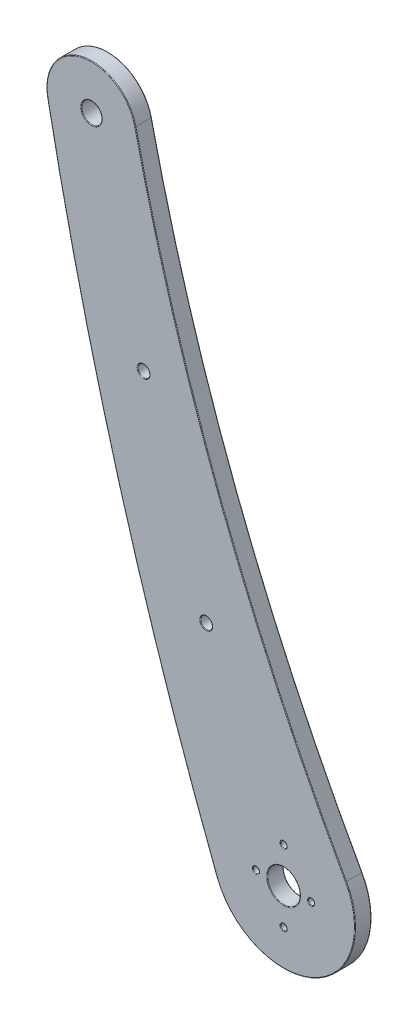
ISO-10303-21;
HEADER;
FILE_DESCRIPTION(('STEP AP214'),'2;1');
FILE_NAME('part.step','',(''),(''),'','','');
FILE_SCHEMA(('AUTOMOTIVE_DESIGN { 1 0 10303 214 1 1 1 1 }'));
ENDSEC;
DATA;
#1=APPLICATION_CONTEXT('core data for automotive mechanical design processes');
#2=APPLICATION_PROTOCOL_DEFINITION('international standard','automotive_design',2000,#1);
#3=PRODUCT_CONTEXT('',#1,'mechanical');
#4=PRODUCT('Part','Part','',(#3));
#5=PRODUCT_RELATED_PRODUCT_CATEGORY('part','',(#4));
#6=PRODUCT_DEFINITION_FORMATION('','',#4);
#7=PRODUCT_DEFINITION_CONTEXT('part definition',#1,'design');
#8=PRODUCT_DEFINITION('design','',#6,#7);
#9=PRODUCT_DEFINITION_SHAPE('','',#8);
#10=(LENGTH_UNIT() NAMED_UNIT(*) SI_UNIT(.MILLI.,.METRE.));
#11=(NAMED_UNIT(*) PLANE_ANGLE_UNIT() SI_UNIT($,.RADIAN.));
#12=(NAMED_UNIT(*) SI_UNIT($,.STERADIAN.) SOLID_ANGLE_UNIT());
#13=UNCERTAINTY_MEASURE_WITH_UNIT(LENGTH_MEASURE(1.E-05),#10,'distance_accuracy_value','');
#14=(GEOMETRIC_REPRESENTATION_CONTEXT(3) GLOBAL_UNCERTAINTY_ASSIGNED_CONTEXT((#13)) GLOBAL_UNIT_ASSIGNED_CONTEXT((#10,
#11,#12)) REPRESENTATION_CONTEXT('',''));
#15=CARTESIAN_POINT('',(0.,0.,0.));
#16=DIRECTION('',(0.,0.,1.));
#17=DIRECTION('',(1.,0.,0.));
#18=AXIS2_PLACEMENT_3D('',#15,#16,#17);
#19=CARTESIAN_POINT('',(-68.1415288653043,199.886277494742,-4.));
#20=DIRECTION('',(0.,0.,1.));
#21=DIRECTION('',(1.,0.,0.));
#22=AXIS2_PLACEMENT_3D('',#19,#20,#21);
#23=CYLINDRICAL_SURFACE('',#22,10.9999999999984);
#24=DIRECTION('',(0.,0.,1.));
#25=VECTOR('',#24,1.);
#26=CARTESIAN_POINT('',(-78.9417734853452,197.799481829795,-4.));
#27=LINE('',#26,#25);
#28=CARTESIAN_POINT('',(-78.9417734853452,197.799481829795,-3.85));
#29=VERTEX_POINT('',#28);
#30=CARTESIAN_POINT('',(-78.9417734853452,197.799481829795,-0.15));
#31=VERTEX_POINT('',#30);
#32=EDGE_CURVE('E226',#29,#31,#27,.T.);
#33=ORIENTED_EDGE('',*,*,#32,.T.);
#34=CARTESIAN_POINT('',(-68.1415288653043,199.886277494742,-0.15));
#35=DIRECTION('',(0.,0.,-1.));
#36=DIRECTION('',(-1.,0.,0.));
#37=AXIS2_PLACEMENT_3D('',#34,#35,#36);
#38=CIRCLE('',#37,10.9999999999984);
#39=CARTESIAN_POINT('',(-57.412483080427,202.312710379858,-0.15));
#40=VERTEX_POINT('',#39);
#41=EDGE_CURVE('E143',#31,#40,#38,.T.);
#42=ORIENTED_EDGE('',*,*,#41,.T.);
#43=DIRECTION('',(0.,0.,1.));
#44=VECTOR('',#43,1.);
#45=CARTESIAN_POINT('',(-57.412483080427,202.312710379858,-4.));
#46=LINE('',#45,#44);
#47=CARTESIAN_POINT('',(-57.412483080427,202.312710379858,-3.85));
#48=VERTEX_POINT('',#47);
#49=EDGE_CURVE('E418',#48,#40,#46,.T.);
#50=ORIENTED_EDGE('',*,*,#49,.F.);
#51=CARTESIAN_POINT('',(-68.1415288653043,199.886277494742,-3.85));
#52=DIRECTION('',(0.,0.,-1.));
#53=DIRECTION('',(-1.,0.,0.));
#54=AXIS2_PLACEMENT_3D('',#51,#52,#53);
#55=CIRCLE('',#54,10.9999999999984);
#56=EDGE_CURVE('E141',#48,#29,#55,.F.);
#57=ORIENTED_EDGE('',*,*,#56,.T.);
#58=EDGE_LOOP('',(#33,#42,#50,#57));
#59=FACE_BOUND('',#58,.T.);
#60=ADVANCED_FACE('F33',(#59),#23,.T.);
#61=CARTESIAN_POINT('',(430.271416232247,312.60511424878,-4.));
#62=DIRECTION('',(0.,0.,1.));
#63=DIRECTION('',(1.,0.,0.));
#64=AXIS2_PLACEMENT_3D('',#61,#62,#63);
#65=CYLINDRICAL_SURFACE('',#64,500.);
#66=ORIENTED_EDGE('',*,*,#49,.T.);
#67=CARTESIAN_POINT('',(430.271416232247,312.60511424878,-0.15));
#68=DIRECTION('',(0.,0.,-1.));
#69=DIRECTION('',(-1.,0.,0.));
#70=AXIS2_PLACEMENT_3D('',#67,#68,#69);
#71=CIRCLE('',#70,500.);
#72=CARTESIAN_POINT('',(-5.87130863623131,68.1065998477744,-0.15));
#73=VERTEX_POINT('',#72);
#74=EDGE_CURVE('E105',#40,#73,#71,.F.);
#75=ORIENTED_EDGE('',*,*,#74,.T.);
#76=DIRECTION('',(0.,0.,1.));
#77=VECTOR('',#76,1.);
#78=CARTESIAN_POINT('',(-5.87130863623131,68.1065998477744,-4.));
#79=LINE('',#78,#77);
#80=CARTESIAN_POINT('',(-5.87130863623131,68.1065998477744,-3.85));
#81=VERTEX_POINT('',#80);
#82=EDGE_CURVE('E414',#81,#73,#79,.T.);
#83=ORIENTED_EDGE('',*,*,#82,.F.);
#84=CARTESIAN_POINT('',(430.271416232247,312.60511424878,-3.85));
#85=DIRECTION('',(0.,0.,-1.));
#86=DIRECTION('',(-1.,0.,0.));
#87=AXIS2_PLACEMENT_3D('',#84,#85,#86);
#88=CIRCLE('',#87,500.);
#89=EDGE_CURVE('E125',#81,#48,#88,.T.);
#90=ORIENTED_EDGE('',*,*,#89,.T.);
#91=EDGE_LOOP('',(#66,#75,#83,#90));
#92=FACE_BOUND('',#91,.T.);
#93=ADVANCED_FACE('F280',(#92),#65,.F.);
#94=CARTESIAN_POINT('',(-21.136304006628,59.5491518437391,-4.));
#95=DIRECTION('',(0.,0.,1.));
#96=DIRECTION('',(1.,0.,0.));
#97=AXIS2_PLACEMENT_3D('',#94,#95,#96);
#98=CYLINDRICAL_SURFACE('',#97,17.4999999999998);
#99=ORIENTED_EDGE('',*,*,#82,.T.);
#100=CARTESIAN_POINT('',(-21.136304006628,59.5491518437391,-0.15));
#101=DIRECTION('',(0.,0.,-1.));
#102=DIRECTION('',(-1.,0.,0.));
#103=AXIS2_PLACEMENT_3D('',#100,#101,#102);
#104=CIRCLE('',#103,17.4999999999998);
#105=CARTESIAN_POINT('',(-37.4645689095466,53.2532988228921,-0.15));
#106=VERTEX_POINT('',#105);
#107=EDGE_CURVE('E134',#73,#106,#104,.T.);
#108=ORIENTED_EDGE('',*,*,#107,.T.);
#109=DIRECTION('',(0.,0.,1.));
#110=VECTOR('',#109,1.);
#111=CARTESIAN_POINT('',(-37.4645689095466,53.2532988228921,-4.));
#112=LINE('',#111,#110);
#113=CARTESIAN_POINT('',(-37.4645689095466,53.2532988228921,-3.85));
#114=VERTEX_POINT('',#113);
#115=EDGE_CURVE('E419',#114,#106,#112,.T.);
#116=ORIENTED_EDGE('',*,*,#115,.F.);
#117=CARTESIAN_POINT('',(-21.136304006628,59.5491518437391,-3.85));
#118=DIRECTION('',(0.,0.,-1.));
#119=DIRECTION('',(-1.,0.,0.));
#120=AXIS2_PLACEMENT_3D('',#117,#118,#119);
#121=CIRCLE('',#120,17.4999999999998);
#122=EDGE_CURVE('E132',#114,#81,#121,.F.);
#123=ORIENTED_EDGE('',*,*,#122,.T.);
#124=EDGE_LOOP('',(#99,#108,#116,#123));
#125=FACE_BOUND('',#124,.T.);
#126=ADVANCED_FACE('F286',(#125),#98,.T.);
#127=CARTESIAN_POINT('',(755.622583517939,359.051874121178,-4.));
#128=DIRECTION('',(0.,0.,1.));
#129=DIRECTION('',(1.,0.,0.));
#130=AXIS2_PLACEMENT_3D('',#127,#128,#129);
#131=CYLINDRICAL_SURFACE('',#130,850.);
#132=ORIENTED_EDGE('',*,*,#115,.T.);
#133=CARTESIAN_POINT('',(755.622583517939,359.051874121178,-0.15));
#134=DIRECTION('',(0.,0.,-1.));
#135=DIRECTION('',(-1.,0.,0.));
#136=AXIS2_PLACEMENT_3D('',#133,#134,#135);
#137=CIRCLE('',#136,850.);
#138=EDGE_CURVE('E139',#106,#31,#137,.T.);
#139=ORIENTED_EDGE('',*,*,#138,.T.);
#140=ORIENTED_EDGE('',*,*,#32,.F.);
#141=CARTESIAN_POINT('',(755.622583517939,359.051874121178,-3.85));
#142=DIRECTION('',(0.,0.,-1.));
#143=DIRECTION('',(-1.,0.,0.));
#144=AXIS2_PLACEMENT_3D('',#141,#142,#143);
#145=CIRCLE('',#144,850.);
#146=EDGE_CURVE('E136',#29,#114,#145,.F.);
#147=ORIENTED_EDGE('',*,*,#146,.T.);
#148=EDGE_LOOP('',(#132,#139,#140,#147));
#149=FACE_BOUND('',#148,.T.);
#150=ADVANCED_FACE('F252',(#149),#131,.T.);
#151=CARTESIAN_POINT('',(181.064943683471,256.245695871761,-4.));
#152=DIRECTION('',(0.,0.,-1.));
#153=DIRECTION('',(-1.,0.,0.));
#154=AXIS2_PLACEMENT_3D('',#151,#152,#153);
#155=PLANE('',#154);
#156=CARTESIAN_POINT('',(-21.136304006628,59.5491518437391,-4.));
#157=DIRECTION('',(0.,0.,-1.));
#158=DIRECTION('',(-1.,0.,0.));
#159=AXIS2_PLACEMENT_3D('',#156,#157,#158);
#160=CIRCLE('',#159,17.3499999999998);
#161=CARTESIAN_POINT('',(-6.00215145369179,68.0332502934542,-4.));
#162=VERTEX_POINT('',#161);
#163=CARTESIAN_POINT('',(-37.3246123532359,53.3072632773565,-4.));
#164=VERTEX_POINT('',#163);
#165=EDGE_CURVE('E42',#162,#164,#160,.T.);
#166=ORIENTED_EDGE('',*,*,#165,.T.);
#167=CARTESIAN_POINT('',(755.622583517939,359.051874121178,-4.));
#168=DIRECTION('',(0.,0.,-1.));
#169=DIRECTION('',(-1.,0.,0.));
#170=AXIS2_PLACEMENT_3D('',#167,#168,#169);
#171=CIRCLE('',#170,849.85);
#172=CARTESIAN_POINT('',(-78.7944974223446,197.827938134317,-4.));
#173=VERTEX_POINT('',#172);
#174=EDGE_CURVE('E11',#164,#173,#171,.T.);
#175=ORIENTED_EDGE('',*,*,#174,.T.);
#176=CARTESIAN_POINT('',(-68.1415288653043,199.886277494742,-4.));
#177=DIRECTION('',(0.,0.,-1.));
#178=DIRECTION('',(-1.,0.,0.));
#179=AXIS2_PLACEMENT_3D('',#176,#177,#178);
#180=CIRCLE('',#179,10.8499999999984);
#181=CARTESIAN_POINT('',(-57.5587882502209,202.279622658697,-4.));
#182=VERTEX_POINT('',#181);
#183=EDGE_CURVE('E217',#173,#182,#180,.T.);
#184=ORIENTED_EDGE('',*,*,#183,.T.);
#185=CARTESIAN_POINT('',(430.271416232247,312.60511424878,-4.));
#186=DIRECTION('',(0.,0.,-1.));
#187=DIRECTION('',(-1.,0.,0.));
#188=AXIS2_PLACEMENT_3D('',#185,#186,#187);
#189=CIRCLE('',#188,500.15);
#190=EDGE_CURVE('E53',#182,#162,#189,.F.);
#191=ORIENTED_EDGE('',*,*,#190,.T.);
#192=EDGE_LOOP('',(#166,#175,#184,#191));
#193=FACE_BOUND('',#192,.T.);
#194=CARTESIAN_POINT('',(-21.136304006628,59.5491518437391,-4.));
#195=DIRECTION('',(0.,0.,-1.));
#196=DIRECTION('',(-1.,0.,0.));
#197=AXIS2_PLACEMENT_3D('',#194,#195,#196);
#198=CIRCLE('',#197,4.15);
#199=CARTESIAN_POINT('',(-25.286304006628,59.5491518437391,-4.));
#200=VERTEX_POINT('',#199);
#201=EDGE_CURVE('E214',#200,#200,#198,.F.);
#202=ORIENTED_EDGE('',*,*,#201,.T.);
#203=EDGE_LOOP('',(#202));
#204=FACE_BOUND('',#203,.T.);
#205=CARTESIAN_POINT('',(-68.1415288653043,199.886277494742,-4.));
#206=DIRECTION('',(0.,0.,-1.));
#207=DIRECTION('',(-1.,0.,0.));
#208=AXIS2_PLACEMENT_3D('',#205,#206,#207);
#209=CIRCLE('',#208,2.65);
#210=CARTESIAN_POINT('',(-70.7915288653043,199.886277494742,-4.));
#211=VERTEX_POINT('',#210);
#212=EDGE_CURVE('E211',#211,#211,#209,.F.);
#213=ORIENTED_EDGE('',*,*,#212,.T.);
#214=EDGE_LOOP('',(#213));
#215=FACE_BOUND('',#214,.T.);
#216=CARTESIAN_POINT('',(-14.386304006628,59.5491518437391,-4.));
#217=DIRECTION('',(0.,0.,-1.));
#218=DIRECTION('',(-1.,0.,0.));
#219=AXIS2_PLACEMENT_3D('',#216,#217,#218);
#220=CIRCLE('',#219,0.9);
#221=CARTESIAN_POINT('',(-15.286304006628,59.5491518437391,-4.));
#222=VERTEX_POINT('',#221);
#223=EDGE_CURVE('E208',#222,#222,#220,.F.);
#224=ORIENTED_EDGE('',*,*,#223,.T.);
#225=EDGE_LOOP('',(#224));
#226=FACE_BOUND('',#225,.T.);
#227=CARTESIAN_POINT('',(-21.136304006628,50.7991518437391,-4.));
#228=DIRECTION('',(0.,0.,-1.));
#229=DIRECTION('',(-1.,0.,0.));
#230=AXIS2_PLACEMENT_3D('',#227,#228,#229);
#231=CIRCLE('',#230,0.900000000000002);
#232=CARTESIAN_POINT('',(-22.036304006628,50.7991518437391,-4.));
#233=VERTEX_POINT('',#232);
#234=EDGE_CURVE('E205',#233,#233,#231,.F.);
#235=ORIENTED_EDGE('',*,*,#234,.T.);
#236=EDGE_LOOP('',(#235));
#237=FACE_BOUND('',#236,.T.);
#238=CARTESIAN_POINT('',(-27.886304006628,59.5491518437391,-4.));
#239=DIRECTION('',(0.,0.,-1.));
#240=DIRECTION('',(-1.,0.,0.));
#241=AXIS2_PLACEMENT_3D('',#238,#239,#240);
#242=CIRCLE('',#241,0.900000000000002);
#243=CARTESIAN_POINT('',(-28.786304006628,59.5491518437391,-4.));
#244=VERTEX_POINT('',#243);
#245=EDGE_CURVE('E202',#244,#244,#242,.F.);
#246=ORIENTED_EDGE('',*,*,#245,.T.);
#247=EDGE_LOOP('',(#246));
#248=FACE_BOUND('',#247,.T.);
#249=CARTESIAN_POINT('',(-21.136304006628,68.2991518437391,-4.));
#250=DIRECTION('',(0.,0.,-1.));
#251=DIRECTION('',(-1.,0.,0.));
#252=AXIS2_PLACEMENT_3D('',#249,#250,#251);
#253=CIRCLE('',#252,0.900000000000002);
#254=CARTESIAN_POINT('',(-22.036304006628,68.2991518437391,-4.));
#255=VERTEX_POINT('',#254);
#256=EDGE_CURVE('E199',#255,#255,#253,.F.);
#257=ORIENTED_EDGE('',*,*,#256,.T.);
#258=EDGE_LOOP('',(#257));
#259=FACE_BOUND('',#258,.T.);
#260=CARTESIAN_POINT('',(-40.081827184473,105.810813754604,-4.));
#261=DIRECTION('',(0.,0.,-1.));
#262=DIRECTION('',(-1.,0.,0.));
#263=AXIS2_PLACEMENT_3D('',#260,#261,#262);
#264=CIRCLE('',#263,1.59999999999999);
#265=CARTESIAN_POINT('',(-41.681827184473,105.810813754604,-4.));
#266=VERTEX_POINT('',#265);
#267=EDGE_CURVE('E196',#266,#266,#264,.F.);
#268=ORIENTED_EDGE('',*,*,#267,.T.);
#269=EDGE_LOOP('',(#268));
#270=FACE_BOUND('',#269,.T.);
#271=CARTESIAN_POINT('',(-55.3980684863694,151.537500699765,-4.));
#272=DIRECTION('',(0.,0.,-1.));
#273=DIRECTION('',(-1.,0.,0.));
#274=AXIS2_PLACEMENT_3D('',#271,#272,#273);
#275=CIRCLE('',#274,1.59999999999999);
#276=CARTESIAN_POINT('',(-56.9980684863694,151.537500699765,-4.));
#277=VERTEX_POINT('',#276);
#278=EDGE_CURVE('E193',#277,#277,#275,.F.);
#279=ORIENTED_EDGE('',*,*,#278,.T.);
#280=EDGE_LOOP('',(#279));
#281=FACE_BOUND('',#280,.T.);
#282=ADVANCED_FACE('F249',(#193,#204,#215,#226,#237,#248,#259,#270,#281),#155,.T.);
#283=CARTESIAN_POINT('',(181.064943683471,256.245695871761,0.));
#284=DIRECTION('',(0.,0.,-1.));
#285=DIRECTION('',(-1.,0.,0.));
#286=AXIS2_PLACEMENT_3D('',#283,#284,#285);
#287=PLANE('',#286);
#288=CARTESIAN_POINT('',(-21.136304006628,59.5491518437391,0.));
#289=DIRECTION('',(0.,0.,-1.));
#290=DIRECTION('',(-1.,0.,0.));
#291=AXIS2_PLACEMENT_3D('',#288,#289,#290);
#292=CIRCLE('',#291,17.3499999999998);
#293=CARTESIAN_POINT('',(-37.3246123532358,53.3072632773566,0.));
#294=VERTEX_POINT('',#293);
#295=CARTESIAN_POINT('',(-6.00215145369198,68.0332502934541,0.));
#296=VERTEX_POINT('',#295);
#297=EDGE_CURVE('E123',#294,#296,#292,.F.);
#298=ORIENTED_EDGE('',*,*,#297,.T.);
#299=CARTESIAN_POINT('',(430.271416232247,312.60511424878,0.));
#300=DIRECTION('',(0.,0.,-1.));
#301=DIRECTION('',(-1.,0.,0.));
#302=AXIS2_PLACEMENT_3D('',#299,#300,#301);
#303=CIRCLE('',#302,500.15);
#304=CARTESIAN_POINT('',(-57.5587882502209,202.279622658697,0.));
#305=VERTEX_POINT('',#304);
#306=EDGE_CURVE('E103',#296,#305,#303,.T.);
#307=ORIENTED_EDGE('',*,*,#306,.T.);
#308=CARTESIAN_POINT('',(-68.1415288653043,199.886277494742,0.));
#309=DIRECTION('',(0.,0.,-1.));
#310=DIRECTION('',(-1.,0.,0.));
#311=AXIS2_PLACEMENT_3D('',#308,#309,#310);
#312=CIRCLE('',#311,10.8499999999984);
#313=CARTESIAN_POINT('',(-78.7944974223446,197.827938134317,0.));
#314=VERTEX_POINT('',#313);
#315=EDGE_CURVE('E111',#305,#314,#312,.F.);
#316=ORIENTED_EDGE('',*,*,#315,.T.);
#317=CARTESIAN_POINT('',(755.622583517939,359.051874121178,0.));
#318=DIRECTION('',(0.,0.,-1.));
#319=DIRECTION('',(-1.,0.,0.));
#320=AXIS2_PLACEMENT_3D('',#317,#318,#319);
#321=CIRCLE('',#320,849.85);
#322=EDGE_CURVE('E117',#314,#294,#321,.F.);
#323=ORIENTED_EDGE('',*,*,#322,.T.);
#324=EDGE_LOOP('',(#298,#307,#316,#323));
#325=FACE_BOUND('',#324,.T.);
#326=CARTESIAN_POINT('',(-21.136304006628,59.5491518437391,0.));
#327=DIRECTION('',(0.,0.,-1.));
#328=DIRECTION('',(-1.,0.,0.));
#329=AXIS2_PLACEMENT_3D('',#326,#327,#328);
#330=CIRCLE('',#329,4.15);
#331=CARTESIAN_POINT('',(-25.286304006628,59.5491518437391,0.));
#332=VERTEX_POINT('',#331);
#333=EDGE_CURVE('E118',#332,#332,#330,.T.);
#334=ORIENTED_EDGE('',*,*,#333,.T.);
#335=EDGE_LOOP('',(#334));
#336=FACE_BOUND('',#335,.T.);
#337=CARTESIAN_POINT('',(-68.1415288653043,199.886277494742,0.));
#338=DIRECTION('',(0.,0.,-1.));
#339=DIRECTION('',(-1.,0.,0.));
#340=AXIS2_PLACEMENT_3D('',#337,#338,#339);
#341=CIRCLE('',#340,2.65);
#342=CARTESIAN_POINT('',(-70.7915288653043,199.886277494742,0.));
#343=VERTEX_POINT('',#342);
#344=EDGE_CURVE('E444',#343,#343,#341,.T.);
#345=ORIENTED_EDGE('',*,*,#344,.T.);
#346=EDGE_LOOP('',(#345));
#347=FACE_BOUND('',#346,.T.);
#348=CARTESIAN_POINT('',(-14.386304006628,59.5491518437391,0.));
#349=DIRECTION('',(0.,0.,-1.));
#350=DIRECTION('',(-1.,0.,0.));
#351=AXIS2_PLACEMENT_3D('',#348,#349,#350);
#352=CIRCLE('',#351,0.9);
#353=CARTESIAN_POINT('',(-15.286304006628,59.5491518437391,0.));
#354=VERTEX_POINT('',#353);
#355=EDGE_CURVE('E441',#354,#354,#352,.T.);
#356=ORIENTED_EDGE('',*,*,#355,.T.);
#357=EDGE_LOOP('',(#356));
#358=FACE_BOUND('',#357,.T.);
#359=CARTESIAN_POINT('',(-21.136304006628,50.7991518437391,0.));
#360=DIRECTION('',(0.,0.,-1.));
#361=DIRECTION('',(-1.,0.,0.));
#362=AXIS2_PLACEMENT_3D('',#359,#360,#361);
#363=CIRCLE('',#362,0.900000000000002);
#364=CARTESIAN_POINT('',(-22.036304006628,50.7991518437391,0.));
#365=VERTEX_POINT('',#364);
#366=EDGE_CURVE('E438',#365,#365,#363,.T.);
#367=ORIENTED_EDGE('',*,*,#366,.T.);
#368=EDGE_LOOP('',(#367));
#369=FACE_BOUND('',#368,.T.);
#370=CARTESIAN_POINT('',(-27.886304006628,59.5491518437391,0.));
#371=DIRECTION('',(0.,0.,-1.));
#372=DIRECTION('',(-1.,0.,0.));
#373=AXIS2_PLACEMENT_3D('',#370,#371,#372);
#374=CIRCLE('',#373,0.900000000000002);
#375=CARTESIAN_POINT('',(-28.786304006628,59.5491518437391,0.));
#376=VERTEX_POINT('',#375);
#377=EDGE_CURVE('E435',#376,#376,#374,.T.);
#378=ORIENTED_EDGE('',*,*,#377,.T.);
#379=EDGE_LOOP('',(#378));
#380=FACE_BOUND('',#379,.T.);
#381=CARTESIAN_POINT('',(-21.136304006628,68.2991518437391,0.));
#382=DIRECTION('',(0.,0.,-1.));
#383=DIRECTION('',(-1.,0.,0.));
#384=AXIS2_PLACEMENT_3D('',#381,#382,#383);
#385=CIRCLE('',#384,0.900000000000002);
#386=CARTESIAN_POINT('',(-22.036304006628,68.2991518437391,0.));
#387=VERTEX_POINT('',#386);
#388=EDGE_CURVE('E432',#387,#387,#385,.T.);
#389=ORIENTED_EDGE('',*,*,#388,.T.);
#390=EDGE_LOOP('',(#389));
#391=FACE_BOUND('',#390,.T.);
#392=CARTESIAN_POINT('',(-40.081827184473,105.810813754604,0.));
#393=DIRECTION('',(0.,0.,-1.));
#394=DIRECTION('',(-1.,0.,0.));
#395=AXIS2_PLACEMENT_3D('',#392,#393,#394);
#396=CIRCLE('',#395,1.59999999999999);
#397=CARTESIAN_POINT('',(-41.681827184473,105.810813754604,0.));
#398=VERTEX_POINT('',#397);
#399=EDGE_CURVE('E429',#398,#398,#396,.T.);
#400=ORIENTED_EDGE('',*,*,#399,.T.);
#401=EDGE_LOOP('',(#400));
#402=FACE_BOUND('',#401,.T.);
#403=CARTESIAN_POINT('',(-55.3980684863694,151.537500699765,0.));
#404=DIRECTION('',(0.,0.,-1.));
#405=DIRECTION('',(-1.,0.,0.));
#406=AXIS2_PLACEMENT_3D('',#403,#404,#405);
#407=CIRCLE('',#406,1.59999999999999);
#408=CARTESIAN_POINT('',(-56.9980684863694,151.537500699765,0.));
#409=VERTEX_POINT('',#408);
#410=EDGE_CURVE('E422',#409,#409,#407,.T.);
#411=ORIENTED_EDGE('',*,*,#410,.T.);
#412=EDGE_LOOP('',(#411));
#413=FACE_BOUND('',#412,.T.);
#414=ADVANCED_FACE('F120',(#325,#336,#347,#358,#369,#380,#391,#402,#413),#287,.F.);
#415=CARTESIAN_POINT('',(-21.136304006628,59.5491518437391,-4.));
#416=DIRECTION('',(0.,0.,1.));
#417=DIRECTION('',(1.,0.,0.));
#418=AXIS2_PLACEMENT_3D('',#415,#416,#417);
#419=CYLINDRICAL_SURFACE('',#418,4.);
#420=CARTESIAN_POINT('',(-21.136304006628,59.5491518437391,-0.15));
#421=DIRECTION('',(0.,0.,-1.));
#422=DIRECTION('',(-1.,0.,0.));
#423=AXIS2_PLACEMENT_3D('',#420,#421,#422);
#424=CIRCLE('',#423,4.);
#425=CARTESIAN_POINT('',(-25.136304006628,59.5491518437391,-0.15));
#426=VERTEX_POINT('',#425);
#427=EDGE_CURVE('E148',#426,#426,#424,.F.);
#428=ORIENTED_EDGE('',*,*,#427,.T.);
#429=EDGE_LOOP('',(#428));
#430=FACE_BOUND('',#429,.T.);
#431=CARTESIAN_POINT('',(-21.136304006628,59.5491518437391,-3.85));
#432=DIRECTION('',(0.,0.,-1.));
#433=DIRECTION('',(-1.,0.,0.));
#434=AXIS2_PLACEMENT_3D('',#431,#432,#433);
#435=CIRCLE('',#434,4.);
#436=CARTESIAN_POINT('',(-25.136304006628,59.5491518437391,-3.85));
#437=VERTEX_POINT('',#436);
#438=EDGE_CURVE('E145',#437,#437,#435,.T.);
#439=ORIENTED_EDGE('',*,*,#438,.T.);
#440=EDGE_LOOP('',(#439));
#441=FACE_BOUND('',#440,.T.);
#442=ADVANCED_FACE('F400',(#430,#441),#419,.F.);
#443=CARTESIAN_POINT('',(-68.1415288653043,199.886277494742,-4.));
#444=DIRECTION('',(0.,0.,1.));
#445=DIRECTION('',(1.,0.,0.));
#446=AXIS2_PLACEMENT_3D('',#443,#444,#445);
#447=CYLINDRICAL_SURFACE('',#446,2.5);
#448=CARTESIAN_POINT('',(-68.1415288653043,199.886277494742,-0.15));
#449=DIRECTION('',(0.,0.,-1.));
#450=DIRECTION('',(-1.,0.,0.));
#451=AXIS2_PLACEMENT_3D('',#448,#449,#450);
#452=CIRCLE('',#451,2.5);
#453=CARTESIAN_POINT('',(-70.6415288653043,199.886277494742,-0.15));
#454=VERTEX_POINT('',#453);
#455=EDGE_CURVE('E154',#454,#454,#452,.F.);
#456=ORIENTED_EDGE('',*,*,#455,.T.);
#457=EDGE_LOOP('',(#456));
#458=FACE_BOUND('',#457,.T.);
#459=CARTESIAN_POINT('',(-68.1415288653043,199.886277494742,-3.85));
#460=DIRECTION('',(0.,0.,-1.));
#461=DIRECTION('',(-1.,0.,0.));
#462=AXIS2_PLACEMENT_3D('',#459,#460,#461);
#463=CIRCLE('',#462,2.5);
#464=CARTESIAN_POINT('',(-70.6415288653043,199.886277494742,-3.85));
#465=VERTEX_POINT('',#464);
#466=EDGE_CURVE('E151',#465,#465,#463,.T.);
#467=ORIENTED_EDGE('',*,*,#466,.T.);
#468=EDGE_LOOP('',(#467));
#469=FACE_BOUND('',#468,.T.);
#470=ADVANCED_FACE('F396',(#458,#469),#447,.F.);
#471=CARTESIAN_POINT('',(-14.386304006628,59.5491518437391,-4.));
#472=DIRECTION('',(0.,0.,1.));
#473=DIRECTION('',(1.,0.,0.));
#474=AXIS2_PLACEMENT_3D('',#471,#472,#473);
#475=CYLINDRICAL_SURFACE('',#474,0.75);
#476=CARTESIAN_POINT('',(-14.386304006628,59.5491518437391,-0.15));
#477=DIRECTION('',(0.,0.,-1.));
#478=DIRECTION('',(-1.,0.,0.));
#479=AXIS2_PLACEMENT_3D('',#476,#477,#478);
#480=CIRCLE('',#479,0.75);
#481=CARTESIAN_POINT('',(-15.136304006628,59.5491518437391,-0.15));
#482=VERTEX_POINT('',#481);
#483=EDGE_CURVE('E160',#482,#482,#480,.F.);
#484=ORIENTED_EDGE('',*,*,#483,.T.);
#485=EDGE_LOOP('',(#484));
#486=FACE_BOUND('',#485,.T.);
#487=CARTESIAN_POINT('',(-14.386304006628,59.5491518437391,-3.85));
#488=DIRECTION('',(0.,0.,-1.));
#489=DIRECTION('',(-1.,0.,0.));
#490=AXIS2_PLACEMENT_3D('',#487,#488,#489);
#491=CIRCLE('',#490,0.75);
#492=CARTESIAN_POINT('',(-15.136304006628,59.5491518437391,-3.85));
#493=VERTEX_POINT('',#492);
#494=EDGE_CURVE('E157',#493,#493,#491,.T.);
#495=ORIENTED_EDGE('',*,*,#494,.T.);
#496=EDGE_LOOP('',(#495));
#497=FACE_BOUND('',#496,.T.);
#498=ADVANCED_FACE('F392',(#486,#497),#475,.F.);
#499=CARTESIAN_POINT('',(-21.136304006628,50.7991518437391,-4.));
#500=DIRECTION('',(0.,0.,1.));
#501=DIRECTION('',(1.,0.,0.));
#502=AXIS2_PLACEMENT_3D('',#499,#500,#501);
#503=CYLINDRICAL_SURFACE('',#502,0.750000000000002);
#504=CARTESIAN_POINT('',(-21.136304006628,50.7991518437391,-0.15));
#505=DIRECTION('',(0.,0.,-1.));
#506=DIRECTION('',(-1.,0.,0.));
#507=AXIS2_PLACEMENT_3D('',#504,#505,#506);
#508=CIRCLE('',#507,0.750000000000002);
#509=CARTESIAN_POINT('',(-21.886304006628,50.7991518437391,-0.15));
#510=VERTEX_POINT('',#509);
#511=EDGE_CURVE('E166',#510,#510,#508,.F.);
#512=ORIENTED_EDGE('',*,*,#511,.T.);
#513=EDGE_LOOP('',(#512));
#514=FACE_BOUND('',#513,.T.);
#515=CARTESIAN_POINT('',(-21.136304006628,50.7991518437391,-3.85));
#516=DIRECTION('',(0.,0.,-1.));
#517=DIRECTION('',(-1.,0.,0.));
#518=AXIS2_PLACEMENT_3D('',#515,#516,#517);
#519=CIRCLE('',#518,0.750000000000002);
#520=CARTESIAN_POINT('',(-21.886304006628,50.7991518437391,-3.85));
#521=VERTEX_POINT('',#520);
#522=EDGE_CURVE('E163',#521,#521,#519,.T.);
#523=ORIENTED_EDGE('',*,*,#522,.T.);
#524=EDGE_LOOP('',(#523));
#525=FACE_BOUND('',#524,.T.);
#526=ADVANCED_FACE('F385',(#514,#525),#503,.F.);
#527=CARTESIAN_POINT('',(-27.886304006628,59.5491518437391,-4.));
#528=DIRECTION('',(0.,0.,1.));
#529=DIRECTION('',(1.,0.,0.));
#530=AXIS2_PLACEMENT_3D('',#527,#528,#529);
#531=CYLINDRICAL_SURFACE('',#530,0.750000000000002);
#532=CARTESIAN_POINT('',(-27.886304006628,59.5491518437391,-0.15));
#533=DIRECTION('',(0.,0.,-1.));
#534=DIRECTION('',(-1.,0.,0.));
#535=AXIS2_PLACEMENT_3D('',#532,#533,#534);
#536=CIRCLE('',#535,0.750000000000002);
#537=CARTESIAN_POINT('',(-28.636304006628,59.5491518437391,-0.15));
#538=VERTEX_POINT('',#537);
#539=EDGE_CURVE('E172',#538,#538,#536,.F.);
#540=ORIENTED_EDGE('',*,*,#539,.T.);
#541=EDGE_LOOP('',(#540));
#542=FACE_BOUND('',#541,.T.);
#543=CARTESIAN_POINT('',(-27.886304006628,59.5491518437391,-3.85));
#544=DIRECTION('',(0.,0.,-1.));
#545=DIRECTION('',(-1.,0.,0.));
#546=AXIS2_PLACEMENT_3D('',#543,#544,#545);
#547=CIRCLE('',#546,0.750000000000002);
#548=CARTESIAN_POINT('',(-28.636304006628,59.5491518437391,-3.85));
#549=VERTEX_POINT('',#548);
#550=EDGE_CURVE('E169',#549,#549,#547,.T.);
#551=ORIENTED_EDGE('',*,*,#550,.T.);
#552=EDGE_LOOP('',(#551));
#553=FACE_BOUND('',#552,.T.);
#554=ADVANCED_FACE('F376',(#542,#553),#531,.F.);
#555=CARTESIAN_POINT('',(-21.136304006628,68.2991518437391,-4.));
#556=DIRECTION('',(0.,0.,1.));
#557=DIRECTION('',(1.,0.,0.));
#558=AXIS2_PLACEMENT_3D('',#555,#556,#557);
#559=CYLINDRICAL_SURFACE('',#558,0.750000000000002);
#560=CARTESIAN_POINT('',(-21.136304006628,68.2991518437391,-0.15));
#561=DIRECTION('',(0.,0.,-1.));
#562=DIRECTION('',(-1.,0.,0.));
#563=AXIS2_PLACEMENT_3D('',#560,#561,#562);
#564=CIRCLE('',#563,0.750000000000002);
#565=CARTESIAN_POINT('',(-21.886304006628,68.2991518437391,-0.15));
#566=VERTEX_POINT('',#565);
#567=EDGE_CURVE('E178',#566,#566,#564,.F.);
#568=ORIENTED_EDGE('',*,*,#567,.T.);
#569=EDGE_LOOP('',(#568));
#570=FACE_BOUND('',#569,.T.);
#571=CARTESIAN_POINT('',(-21.136304006628,68.2991518437391,-3.85));
#572=DIRECTION('',(0.,0.,-1.));
#573=DIRECTION('',(-1.,0.,0.));
#574=AXIS2_PLACEMENT_3D('',#571,#572,#573);
#575=CIRCLE('',#574,0.750000000000002);
#576=CARTESIAN_POINT('',(-21.886304006628,68.2991518437391,-3.85));
#577=VERTEX_POINT('',#576);
#578=EDGE_CURVE('E175',#577,#577,#575,.T.);
#579=ORIENTED_EDGE('',*,*,#578,.T.);
#580=EDGE_LOOP('',(#579));
#581=FACE_BOUND('',#580,.T.);
#582=ADVANCED_FACE('F373',(#570,#581),#559,.F.);
#583=CARTESIAN_POINT('',(-40.081827184473,105.810813754604,0.));
#584=DIRECTION('',(0.,0.,1.));
#585=DIRECTION('',(1.,0.,0.));
#586=AXIS2_PLACEMENT_3D('',#583,#584,#585);
#587=CYLINDRICAL_SURFACE('',#586,1.44999999999999);
#588=CARTESIAN_POINT('',(-40.081827184473,105.810813754604,-0.15));
#589=DIRECTION('',(0.,0.,-1.));
#590=DIRECTION('',(-1.,0.,0.));
#591=AXIS2_PLACEMENT_3D('',#588,#589,#590);
#592=CIRCLE('',#591,1.44999999999999);
#593=CARTESIAN_POINT('',(-41.531827184473,105.810813754604,-0.15));
#594=VERTEX_POINT('',#593);
#595=EDGE_CURVE('E184',#594,#594,#592,.F.);
#596=ORIENTED_EDGE('',*,*,#595,.T.);
#597=EDGE_LOOP('',(#596));
#598=FACE_BOUND('',#597,.T.);
#599=CARTESIAN_POINT('',(-40.081827184473,105.810813754604,-3.85));
#600=DIRECTION('',(0.,0.,-1.));
#601=DIRECTION('',(-1.,0.,0.));
#602=AXIS2_PLACEMENT_3D('',#599,#600,#601);
#603=CIRCLE('',#602,1.44999999999999);
#604=CARTESIAN_POINT('',(-41.531827184473,105.810813754604,-3.85));
#605=VERTEX_POINT('',#604);
#606=EDGE_CURVE('E181',#605,#605,#603,.T.);
#607=ORIENTED_EDGE('',*,*,#606,.T.);
#608=EDGE_LOOP('',(#607));
#609=FACE_BOUND('',#608,.T.);
#610=ADVANCED_FACE('F375',(#598,#609),#587,.F.);
#611=CARTESIAN_POINT('',(-55.3980684863694,151.537500699765,0.));
#612=DIRECTION('',(0.,0.,1.));
#613=DIRECTION('',(1.,0.,0.));
#614=AXIS2_PLACEMENT_3D('',#611,#612,#613);
#615=CYLINDRICAL_SURFACE('',#614,1.44999999999999);
#616=CARTESIAN_POINT('',(-55.3980684863694,151.537500699765,-0.15));
#617=DIRECTION('',(0.,0.,-1.));
#618=DIRECTION('',(-1.,0.,0.));
#619=AXIS2_PLACEMENT_3D('',#616,#617,#618);
#620=CIRCLE('',#619,1.44999999999999);
#621=CARTESIAN_POINT('',(-56.8480684863694,151.537500699765,-0.15));
#622=VERTEX_POINT('',#621);
#623=EDGE_CURVE('E190',#622,#622,#620,.F.);
#624=ORIENTED_EDGE('',*,*,#623,.T.);
#625=EDGE_LOOP('',(#624));
#626=FACE_BOUND('',#625,.T.);
#627=CARTESIAN_POINT('',(-55.3980684863694,151.537500699765,-3.85));
#628=DIRECTION('',(0.,0.,-1.));
#629=DIRECTION('',(-1.,0.,0.));
#630=AXIS2_PLACEMENT_3D('',#627,#628,#629);
#631=CIRCLE('',#630,1.44999999999999);
#632=CARTESIAN_POINT('',(-56.8480684863694,151.537500699765,-3.85));
#633=VERTEX_POINT('',#632);
#634=EDGE_CURVE('E187',#633,#633,#631,.T.);
#635=ORIENTED_EDGE('',*,*,#634,.T.);
#636=EDGE_LOOP('',(#635));
#637=FACE_BOUND('',#636,.T.);
#638=ADVANCED_FACE('F305',(#626,#637),#615,.F.);
#639=CARTESIAN_POINT('',(755.622583517939,359.051874121178,-0.15));
#640=DIRECTION('',(0.,0.,-1.));
#641=DIRECTION('',(-1.,0.,0.));
#642=AXIS2_PLACEMENT_3D('',#639,#640,#641);
#643=TOROIDAL_SURFACE('',#642,849.85,0.15);
#644=CARTESIAN_POINT('',(-78.7944974223446,197.827938134317,-0.15));
#645=DIRECTION('',(-0.189708696813343,0.981840420003874,0.));
#646=DIRECTION('',(-0.981840420003874,-0.189708696813343,0.));
#647=AXIS2_PLACEMENT_3D('',#644,#645,#646);
#648=CIRCLE('',#647,0.15);
#649=EDGE_CURVE('E114',#31,#314,#648,.T.);
#650=ORIENTED_EDGE('',*,*,#649,.F.);
#651=ORIENTED_EDGE('',*,*,#138,.F.);
#652=CARTESIAN_POINT('',(-37.3246123532358,53.3072632773566,-0.15));
#653=DIRECTION('',(0.359763029762661,-0.93304370873823,0.));
#654=DIRECTION('',(0.93304370873823,0.359763029762661,0.));
#655=AXIS2_PLACEMENT_3D('',#652,#653,#654);
#656=CIRCLE('',#655,0.15);
#657=EDGE_CURVE('E223',#294,#106,#656,.T.);
#658=ORIENTED_EDGE('',*,*,#657,.F.);
#659=ORIENTED_EDGE('',*,*,#322,.F.);
#660=EDGE_LOOP('',(#650,#651,#658,#659));
#661=FACE_BOUND('',#660,.T.);
#662=ADVANCED_FACE('F301',(#661),#643,.T.);
#663=CARTESIAN_POINT('',(-21.136304006628,59.5491518437391,-0.15));
#664=DIRECTION('',(0.,0.,-1.));
#665=DIRECTION('',(-1.,0.,0.));
#666=AXIS2_PLACEMENT_3D('',#663,#664,#665);
#667=TOROIDAL_SURFACE('',#666,17.3499999999998,0.15);
#668=ORIENTED_EDGE('',*,*,#657,.T.);
#669=ORIENTED_EDGE('',*,*,#107,.F.);
#670=CARTESIAN_POINT('',(-6.00215145369198,68.0332502934541,-0.15));
#671=DIRECTION('',(-0.488997028801994,0.872285449736966,0.));
#672=DIRECTION('',(-0.872285449736967,-0.488997028801994,0.));
#673=AXIS2_PLACEMENT_3D('',#670,#671,#672);
#674=CIRCLE('',#673,0.15);
#675=EDGE_CURVE('E108',#296,#73,#674,.T.);
#676=ORIENTED_EDGE('',*,*,#675,.F.);
#677=ORIENTED_EDGE('',*,*,#297,.F.);
#678=EDGE_LOOP('',(#668,#669,#676,#677));
#679=FACE_BOUND('',#678,.T.);
#680=ADVANCED_FACE('F298',(#679),#667,.T.);
#681=CARTESIAN_POINT('',(-68.1415288653043,199.886277494742,-0.15));
#682=DIRECTION('',(0.,0.,-1.));
#683=DIRECTION('',(-1.,0.,0.));
#684=AXIS2_PLACEMENT_3D('',#681,#682,#683);
#685=TOROIDAL_SURFACE('',#684,10.8499999999984,0.15);
#686=ORIENTED_EDGE('',*,*,#649,.T.);
#687=ORIENTED_EDGE('',*,*,#315,.F.);
#688=CARTESIAN_POINT('',(-57.5587882502209,202.279622658697,-0.15));
#689=DIRECTION('',(0.220584807737826,-0.975367798625353,0.));
#690=DIRECTION('',(0.975367798625353,0.220584807737826,0.));
#691=AXIS2_PLACEMENT_3D('',#688,#689,#690);
#692=CIRCLE('',#691,0.15);
#693=EDGE_CURVE('E99',#40,#305,#692,.T.);
#694=ORIENTED_EDGE('',*,*,#693,.F.);
#695=ORIENTED_EDGE('',*,*,#41,.F.);
#696=EDGE_LOOP('',(#686,#687,#694,#695));
#697=FACE_BOUND('',#696,.T.);
#698=ADVANCED_FACE('F112',(#697),#685,.T.);
#699=CARTESIAN_POINT('',(430.271416232247,312.60511424878,-0.15));
#700=DIRECTION('',(0.,0.,-1.));
#701=DIRECTION('',(-1.,0.,0.));
#702=AXIS2_PLACEMENT_3D('',#699,#700,#701);
#703=TOROIDAL_SURFACE('',#702,500.15,0.15);
#704=ORIENTED_EDGE('',*,*,#675,.T.);
#705=ORIENTED_EDGE('',*,*,#74,.F.);
#706=ORIENTED_EDGE('',*,*,#693,.T.);
#707=ORIENTED_EDGE('',*,*,#306,.F.);
#708=EDGE_LOOP('',(#704,#705,#706,#707));
#709=FACE_BOUND('',#708,.T.);
#710=ADVANCED_FACE('F101',(#709),#703,.T.);
#711=CARTESIAN_POINT('',(-21.136304006628,59.5491518437391,-0.15));
#712=DIRECTION('',(0.,0.,-1.));
#713=DIRECTION('',(-1.,0.,0.));
#714=AXIS2_PLACEMENT_3D('',#711,#712,#713);
#715=TOROIDAL_SURFACE('',#714,4.15,0.15);
#716=ORIENTED_EDGE('',*,*,#333,.F.);
#717=EDGE_LOOP('',(#716));
#718=FACE_BOUND('',#717,.T.);
#719=ORIENTED_EDGE('',*,*,#427,.F.);
#720=EDGE_LOOP('',(#719));
#721=FACE_BOUND('',#720,.T.);
#722=ADVANCED_FACE('F295',(#718,#721),#715,.T.);
#723=CARTESIAN_POINT('',(-68.1415288653043,199.886277494742,-0.15));
#724=DIRECTION('',(0.,0.,-1.));
#725=DIRECTION('',(-1.,0.,0.));
#726=AXIS2_PLACEMENT_3D('',#723,#724,#725);
#727=TOROIDAL_SURFACE('',#726,2.65,0.15);
#728=ORIENTED_EDGE('',*,*,#344,.F.);
#729=EDGE_LOOP('',(#728));
#730=FACE_BOUND('',#729,.T.);
#731=ORIENTED_EDGE('',*,*,#455,.F.);
#732=EDGE_LOOP('',(#731));
#733=FACE_BOUND('',#732,.T.);
#734=ADVANCED_FACE('F309',(#730,#733),#727,.T.);
#735=CARTESIAN_POINT('',(-14.386304006628,59.5491518437391,-0.15));
#736=DIRECTION('',(0.,0.,-1.));
#737=DIRECTION('',(-1.,0.,0.));
#738=AXIS2_PLACEMENT_3D('',#735,#736,#737);
#739=TOROIDAL_SURFACE('',#738,0.9,0.15);
#740=ORIENTED_EDGE('',*,*,#355,.F.);
#741=EDGE_LOOP('',(#740));
#742=FACE_BOUND('',#741,.T.);
#743=ORIENTED_EDGE('',*,*,#483,.F.);
#744=EDGE_LOOP('',(#743));
#745=FACE_BOUND('',#744,.T.);
#746=ADVANCED_FACE('F313',(#742,#745),#739,.T.);
#747=CARTESIAN_POINT('',(-21.136304006628,50.7991518437391,-0.15));
#748=DIRECTION('',(0.,0.,-1.));
#749=DIRECTION('',(-1.,0.,0.));
#750=AXIS2_PLACEMENT_3D('',#747,#748,#749);
#751=TOROIDAL_SURFACE('',#750,0.900000000000002,0.15);
#752=ORIENTED_EDGE('',*,*,#366,.F.);
#753=EDGE_LOOP('',(#752));
#754=FACE_BOUND('',#753,.T.);
#755=ORIENTED_EDGE('',*,*,#511,.F.);
#756=EDGE_LOOP('',(#755));
#757=FACE_BOUND('',#756,.T.);
#758=ADVANCED_FACE('F317',(#754,#757),#751,.T.);
#759=CARTESIAN_POINT('',(-27.886304006628,59.5491518437391,-0.15));
#760=DIRECTION('',(0.,0.,-1.));
#761=DIRECTION('',(-1.,0.,0.));
#762=AXIS2_PLACEMENT_3D('',#759,#760,#761);
#763=TOROIDAL_SURFACE('',#762,0.900000000000002,0.15);
#764=ORIENTED_EDGE('',*,*,#377,.F.);
#765=EDGE_LOOP('',(#764));
#766=FACE_BOUND('',#765,.T.);
#767=ORIENTED_EDGE('',*,*,#539,.F.);
#768=EDGE_LOOP('',(#767));
#769=FACE_BOUND('',#768,.T.);
#770=ADVANCED_FACE('F321',(#766,#769),#763,.T.);
#771=CARTESIAN_POINT('',(-21.136304006628,68.2991518437391,-0.15));
#772=DIRECTION('',(0.,0.,-1.));
#773=DIRECTION('',(-1.,0.,0.));
#774=AXIS2_PLACEMENT_3D('',#771,#772,#773);
#775=TOROIDAL_SURFACE('',#774,0.900000000000002,0.15);
#776=ORIENTED_EDGE('',*,*,#388,.F.);
#777=EDGE_LOOP('',(#776));
#778=FACE_BOUND('',#777,.T.);
#779=ORIENTED_EDGE('',*,*,#567,.F.);
#780=EDGE_LOOP('',(#779));
#781=FACE_BOUND('',#780,.T.);
#782=ADVANCED_FACE('F325',(#778,#781),#775,.T.);
#783=CARTESIAN_POINT('',(-40.081827184473,105.810813754604,-0.15));
#784=DIRECTION('',(0.,0.,-1.));
#785=DIRECTION('',(-1.,0.,0.));
#786=AXIS2_PLACEMENT_3D('',#783,#784,#785);
#787=TOROIDAL_SURFACE('',#786,1.59999999999999,0.15);
#788=ORIENTED_EDGE('',*,*,#399,.F.);
#789=EDGE_LOOP('',(#788));
#790=FACE_BOUND('',#789,.T.);
#791=ORIENTED_EDGE('',*,*,#595,.F.);
#792=EDGE_LOOP('',(#791));
#793=FACE_BOUND('',#792,.T.);
#794=ADVANCED_FACE('F329',(#790,#793),#787,.T.);
#795=CARTESIAN_POINT('',(-55.3980684863694,151.537500699765,-0.15));
#796=DIRECTION('',(0.,0.,-1.));
#797=DIRECTION('',(-1.,0.,0.));
#798=AXIS2_PLACEMENT_3D('',#795,#796,#797);
#799=TOROIDAL_SURFACE('',#798,1.59999999999999,0.15);
#800=ORIENTED_EDGE('',*,*,#410,.F.);
#801=EDGE_LOOP('',(#800));
#802=FACE_BOUND('',#801,.T.);
#803=ORIENTED_EDGE('',*,*,#623,.F.);
#804=EDGE_LOOP('',(#803));
#805=FACE_BOUND('',#804,.T.);
#806=ADVANCED_FACE('F333',(#802,#805),#799,.T.);
#807=CARTESIAN_POINT('',(430.271416232247,312.60511424878,-3.85));
#808=DIRECTION('',(0.,0.,-1.));
#809=DIRECTION('',(-1.,0.,0.));
#810=AXIS2_PLACEMENT_3D('',#807,#808,#809);
#811=TOROIDAL_SURFACE('',#810,500.15,0.15);
#812=CARTESIAN_POINT('',(-6.00215145369179,68.0332502934542,-3.85));
#813=DIRECTION('',(0.488997028801989,-0.87228544973697,0.));
#814=DIRECTION('',(0.87228544973697,0.488997028801989,0.));
#815=AXIS2_PLACEMENT_3D('',#812,#813,#814);
#816=CIRCLE('',#815,0.15);
#817=EDGE_CURVE('E230',#162,#81,#816,.T.);
#818=ORIENTED_EDGE('',*,*,#817,.F.);
#819=ORIENTED_EDGE('',*,*,#190,.F.);
#820=CARTESIAN_POINT('',(-57.5587882502208,202.279622658697,-3.85));
#821=DIRECTION('',(-0.220584807737826,0.975367798625353,0.));
#822=DIRECTION('',(-0.975367798625353,-0.220584807737826,0.));
#823=AXIS2_PLACEMENT_3D('',#820,#821,#822);
#824=CIRCLE('',#823,0.15);
#825=EDGE_CURVE('E37',#48,#182,#824,.T.);
#826=ORIENTED_EDGE('',*,*,#825,.F.);
#827=ORIENTED_EDGE('',*,*,#89,.F.);
#828=EDGE_LOOP('',(#818,#819,#826,#827));
#829=FACE_BOUND('',#828,.T.);
#830=ADVANCED_FACE('F243',(#829),#811,.T.);
#831=CARTESIAN_POINT('',(-68.1415288653043,199.886277494742,-3.85));
#832=DIRECTION('',(0.,0.,-1.));
#833=DIRECTION('',(-1.,0.,0.));
#834=AXIS2_PLACEMENT_3D('',#831,#832,#833);
#835=TOROIDAL_SURFACE('',#834,10.8499999999984,0.15);
#836=ORIENTED_EDGE('',*,*,#825,.T.);
#837=ORIENTED_EDGE('',*,*,#183,.F.);
#838=CARTESIAN_POINT('',(-78.7944974223446,197.827938134317,-3.85));
#839=DIRECTION('',(0.189708696813343,-0.981840420003874,-1.81676973465989E-13));
#840=DIRECTION('',(0.981840420003874,0.189708696813343,0.));
#841=AXIS2_PLACEMENT_3D('',#838,#839,#840);
#842=CIRCLE('',#841,0.15);
#843=EDGE_CURVE('E229',#29,#173,#842,.T.);
#844=ORIENTED_EDGE('',*,*,#843,.F.);
#845=ORIENTED_EDGE('',*,*,#56,.F.);
#846=EDGE_LOOP('',(#836,#837,#844,#845));
#847=FACE_BOUND('',#846,.T.);
#848=ADVANCED_FACE('F239',(#847),#835,.T.);
#849=CARTESIAN_POINT('',(-21.136304006628,59.5491518437391,-3.85));
#850=DIRECTION('',(0.,0.,-1.));
#851=DIRECTION('',(-1.,0.,0.));
#852=AXIS2_PLACEMENT_3D('',#849,#850,#851);
#853=TOROIDAL_SURFACE('',#852,17.3499999999998,0.15);
#854=ORIENTED_EDGE('',*,*,#817,.T.);
#855=ORIENTED_EDGE('',*,*,#122,.F.);
#856=CARTESIAN_POINT('',(-37.3246123532359,53.3072632773565,-3.85));
#857=DIRECTION('',(-0.359763029762661,0.93304370873823,0.));
#858=DIRECTION('',(-0.93304370873823,-0.359763029762661,0.));
#859=AXIS2_PLACEMENT_3D('',#856,#857,#858);
#860=CIRCLE('',#859,0.15);
#861=EDGE_CURVE('E227',#164,#114,#860,.T.);
#862=ORIENTED_EDGE('',*,*,#861,.F.);
#863=ORIENTED_EDGE('',*,*,#165,.F.);
#864=EDGE_LOOP('',(#854,#855,#862,#863));
#865=FACE_BOUND('',#864,.T.);
#866=ADVANCED_FACE('F245',(#865),#853,.T.);
#867=CARTESIAN_POINT('',(755.622583517939,359.051874121178,-3.85));
#868=DIRECTION('',(0.,0.,-1.));
#869=DIRECTION('',(-1.,0.,0.));
#870=AXIS2_PLACEMENT_3D('',#867,#868,#869);
#871=TOROIDAL_SURFACE('',#870,849.85,0.15);
#872=ORIENTED_EDGE('',*,*,#843,.T.);
#873=ORIENTED_EDGE('',*,*,#174,.F.);
#874=ORIENTED_EDGE('',*,*,#861,.T.);
#875=ORIENTED_EDGE('',*,*,#146,.F.);
#876=EDGE_LOOP('',(#872,#873,#874,#875));
#877=FACE_BOUND('',#876,.T.);
#878=ADVANCED_FACE('F248',(#877),#871,.T.);
#879=CARTESIAN_POINT('',(-21.136304006628,59.5491518437391,-3.85));
#880=DIRECTION('',(0.,0.,-1.));
#881=DIRECTION('',(-1.,0.,0.));
#882=AXIS2_PLACEMENT_3D('',#879,#880,#881);
#883=TOROIDAL_SURFACE('',#882,4.15,0.15);
#884=ORIENTED_EDGE('',*,*,#438,.F.);
#885=EDGE_LOOP('',(#884));
#886=FACE_BOUND('',#885,.T.);
#887=ORIENTED_EDGE('',*,*,#201,.F.);
#888=EDGE_LOOP('',(#887));
#889=FACE_BOUND('',#888,.T.);
#890=ADVANCED_FACE('F340',(#886,#889),#883,.T.);
#891=CARTESIAN_POINT('',(-68.1415288653043,199.886277494742,-3.85));
#892=DIRECTION('',(0.,0.,-1.));
#893=DIRECTION('',(-1.,0.,0.));
#894=AXIS2_PLACEMENT_3D('',#891,#892,#893);
#895=TOROIDAL_SURFACE('',#894,2.65,0.15);
#896=ORIENTED_EDGE('',*,*,#466,.F.);
#897=EDGE_LOOP('',(#896));
#898=FACE_BOUND('',#897,.T.);
#899=ORIENTED_EDGE('',*,*,#212,.F.);
#900=EDGE_LOOP('',(#899));
#901=FACE_BOUND('',#900,.T.);
#902=ADVANCED_FACE('F349',(#898,#901),#895,.T.);
#903=CARTESIAN_POINT('',(-14.386304006628,59.5491518437391,-3.85));
#904=DIRECTION('',(0.,0.,-1.));
#905=DIRECTION('',(-1.,0.,0.));
#906=AXIS2_PLACEMENT_3D('',#903,#904,#905);
#907=TOROIDAL_SURFACE('',#906,0.9,0.15);
#908=ORIENTED_EDGE('',*,*,#494,.F.);
#909=EDGE_LOOP('',(#908));
#910=FACE_BOUND('',#909,.T.);
#911=ORIENTED_EDGE('',*,*,#223,.F.);
#912=EDGE_LOOP('',(#911));
#913=FACE_BOUND('',#912,.T.);
#914=ADVANCED_FACE('F353',(#910,#913),#907,.T.);
#915=CARTESIAN_POINT('',(-21.136304006628,50.7991518437391,-3.85));
#916=DIRECTION('',(0.,0.,-1.));
#917=DIRECTION('',(-1.,0.,0.));
#918=AXIS2_PLACEMENT_3D('',#915,#916,#917);
#919=TOROIDAL_SURFACE('',#918,0.900000000000002,0.15);
#920=ORIENTED_EDGE('',*,*,#522,.F.);
#921=EDGE_LOOP('',(#920));
#922=FACE_BOUND('',#921,.T.);
#923=ORIENTED_EDGE('',*,*,#234,.F.);
#924=EDGE_LOOP('',(#923));
#925=FACE_BOUND('',#924,.T.);
#926=ADVANCED_FACE('F357',(#922,#925),#919,.T.);
#927=CARTESIAN_POINT('',(-27.886304006628,59.5491518437391,-3.85));
#928=DIRECTION('',(0.,0.,-1.));
#929=DIRECTION('',(-1.,0.,0.));
#930=AXIS2_PLACEMENT_3D('',#927,#928,#929);
#931=TOROIDAL_SURFACE('',#930,0.900000000000002,0.15);
#932=ORIENTED_EDGE('',*,*,#550,.F.);
#933=EDGE_LOOP('',(#932));
#934=FACE_BOUND('',#933,.T.);
#935=ORIENTED_EDGE('',*,*,#245,.F.);
#936=EDGE_LOOP('',(#935));
#937=FACE_BOUND('',#936,.T.);
#938=ADVANCED_FACE('F361',(#934,#937),#931,.T.);
#939=CARTESIAN_POINT('',(-21.136304006628,68.2991518437391,-3.85));
#940=DIRECTION('',(0.,0.,-1.));
#941=DIRECTION('',(-1.,0.,0.));
#942=AXIS2_PLACEMENT_3D('',#939,#940,#941);
#943=TOROIDAL_SURFACE('',#942,0.900000000000002,0.15);
#944=ORIENTED_EDGE('',*,*,#578,.F.);
#945=EDGE_LOOP('',(#944));
#946=FACE_BOUND('',#945,.T.);
#947=ORIENTED_EDGE('',*,*,#256,.F.);
#948=EDGE_LOOP('',(#947));
#949=FACE_BOUND('',#948,.T.);
#950=ADVANCED_FACE('F276',(#946,#949),#943,.T.);
#951=CARTESIAN_POINT('',(-40.081827184473,105.810813754604,-3.85));
#952=DIRECTION('',(0.,0.,-1.));
#953=DIRECTION('',(-1.,0.,0.));
#954=AXIS2_PLACEMENT_3D('',#951,#952,#953);
#955=TOROIDAL_SURFACE('',#954,1.59999999999999,0.15);
#956=ORIENTED_EDGE('',*,*,#606,.F.);
#957=EDGE_LOOP('',(#956));
#958=FACE_BOUND('',#957,.T.);
#959=ORIENTED_EDGE('',*,*,#267,.F.);
#960=EDGE_LOOP('',(#959));
#961=FACE_BOUND('',#960,.T.);
#962=ADVANCED_FACE('F271',(#958,#961),#955,.T.);
#963=CARTESIAN_POINT('',(-55.3980684863694,151.537500699765,-3.85));
#964=DIRECTION('',(0.,0.,-1.));
#965=DIRECTION('',(-1.,0.,0.));
#966=AXIS2_PLACEMENT_3D('',#963,#964,#965);
#967=TOROIDAL_SURFACE('',#966,1.59999999999999,0.15);
#968=ORIENTED_EDGE('',*,*,#634,.F.);
#969=EDGE_LOOP('',(#968));
#970=FACE_BOUND('',#969,.T.);
#971=ORIENTED_EDGE('',*,*,#278,.F.);
#972=EDGE_LOOP('',(#971));
#973=FACE_BOUND('',#972,.T.);
#974=ADVANCED_FACE('F35',(#970,#973),#967,.T.);
#975=CLOSED_SHELL('',(#60,#93,#126,#150,#282,#414,#442,#470,#498,#526,#554,#582,#610,#638,#662,
#680,#698,#710,#722,#734,#746,#758,#770,#782,#794,#806,#830,#848,#866,#878,#890,#902,#914,#926,
#938,#950,#962,#974));
#976=MANIFOLD_SOLID_BREP('B2',#975);
#977=ADVANCED_BREP_SHAPE_REPRESENTATION('',(#18,#976),#14);
#978=SHAPE_DEFINITION_REPRESENTATION(#9,#977);
ENDSEC;
END-ISO-10303-21;
